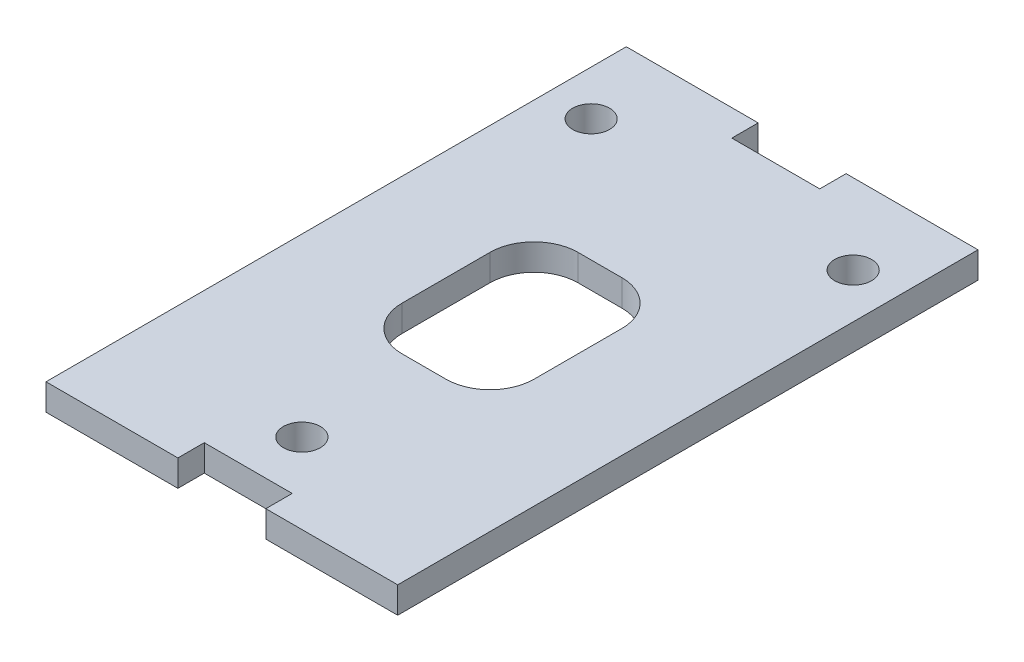
ISO-10303-21;
HEADER;
FILE_DESCRIPTION(('STEP AP214'),'2;1');
FILE_NAME('part.step','',(''),(''),'','','');
FILE_SCHEMA(('AUTOMOTIVE_DESIGN { 1 0 10303 214 1 1 1 1 }'));
ENDSEC;
DATA;
#1=APPLICATION_CONTEXT('core data for automotive mechanical design processes');
#2=APPLICATION_PROTOCOL_DEFINITION('international standard','automotive_design',2000,#1);
#3=PRODUCT_CONTEXT('',#1,'mechanical');
#4=PRODUCT('Part','Part','',(#3));
#5=PRODUCT_RELATED_PRODUCT_CATEGORY('part','',(#4));
#6=PRODUCT_DEFINITION_FORMATION('','',#4);
#7=PRODUCT_DEFINITION_CONTEXT('part definition',#1,'design');
#8=PRODUCT_DEFINITION('design','',#6,#7);
#9=PRODUCT_DEFINITION_SHAPE('','',#8);
#10=(LENGTH_UNIT() NAMED_UNIT(*) SI_UNIT(.MILLI.,.METRE.));
#11=(NAMED_UNIT(*) PLANE_ANGLE_UNIT() SI_UNIT($,.RADIAN.));
#12=(NAMED_UNIT(*) SI_UNIT($,.STERADIAN.) SOLID_ANGLE_UNIT());
#13=UNCERTAINTY_MEASURE_WITH_UNIT(LENGTH_MEASURE(1.E-05),#10,'distance_accuracy_value','');
#14=(GEOMETRIC_REPRESENTATION_CONTEXT(3) GLOBAL_UNCERTAINTY_ASSIGNED_CONTEXT((#13)) GLOBAL_UNIT_ASSIGNED_CONTEXT((#10,
#11,#12)) REPRESENTATION_CONTEXT('',''));
#15=CARTESIAN_POINT('',(0.,0.,0.));
#16=DIRECTION('',(0.,0.,1.));
#17=DIRECTION('',(1.,0.,0.));
#18=AXIS2_PLACEMENT_3D('',#15,#16,#17);
#19=CARTESIAN_POINT('',(0.,3.,-2.99999999999996));
#20=DIRECTION('',(0.,0.,-1.));
#21=DIRECTION('',(-1.,0.,0.));
#22=AXIS2_PLACEMENT_3D('',#19,#20,#21);
#23=PLANE('',#22);
#24=DIRECTION('',(1.,0.,0.));
#25=VECTOR('',#24,1.);
#26=CARTESIAN_POINT('',(0.,0.,-2.99999999999996));
#27=LINE('',#26,#25);
#28=CARTESIAN_POINT('',(15.,0.,-2.99999999999998));
#29=VERTEX_POINT('',#28);
#30=CARTESIAN_POINT('',(25.,0.,-2.99999999999999));
#31=VERTEX_POINT('',#30);
#32=EDGE_CURVE('E196',#29,#31,#27,.T.);
#33=ORIENTED_EDGE('',*,*,#32,.T.);
#34=DIRECTION('',(0.,-1.,0.));
#35=VECTOR('',#34,1.);
#36=CARTESIAN_POINT('',(25.,3.,-2.99999999999999));
#37=LINE('',#36,#35);
#38=CARTESIAN_POINT('',(25.,3.,-2.99999999999999));
#39=VERTEX_POINT('',#38);
#40=EDGE_CURVE('E194',#39,#31,#37,.T.);
#41=ORIENTED_EDGE('',*,*,#40,.F.);
#42=DIRECTION('',(1.,0.,0.));
#43=VECTOR('',#42,1.);
#44=CARTESIAN_POINT('',(0.,3.,-2.99999999999996));
#45=LINE('',#44,#43);
#46=CARTESIAN_POINT('',(15.,3.,-2.99999999999998));
#47=VERTEX_POINT('',#46);
#48=EDGE_CURVE('E180',#47,#39,#45,.T.);
#49=ORIENTED_EDGE('',*,*,#48,.F.);
#50=DIRECTION('',(0.,-1.,0.));
#51=VECTOR('',#50,1.);
#52=CARTESIAN_POINT('',(15.,3.,-2.99999999999998));
#53=LINE('',#52,#51);
#54=EDGE_CURVE('E244',#47,#29,#53,.T.);
#55=ORIENTED_EDGE('',*,*,#54,.T.);
#56=EDGE_LOOP('',(#33,#41,#49,#55));
#57=FACE_BOUND('',#56,.T.);
#58=ADVANCED_FACE('F42',(#57),#23,.F.);
#59=CARTESIAN_POINT('',(25.,3.,0.));
#60=DIRECTION('',(-1.,0.,0.));
#61=DIRECTION('',(0.,0.,1.));
#62=AXIS2_PLACEMENT_3D('',#59,#60,#61);
#63=PLANE('',#62);
#64=DIRECTION('',(0.,0.,-1.));
#65=VECTOR('',#64,1.);
#66=CARTESIAN_POINT('',(25.,0.,0.));
#67=LINE('',#66,#65);
#68=CARTESIAN_POINT('',(25.,0.,0.));
#69=VERTEX_POINT('',#68);
#70=EDGE_CURVE('E260',#69,#31,#67,.T.);
#71=ORIENTED_EDGE('',*,*,#70,.F.);
#72=DIRECTION('',(0.,-1.,0.));
#73=VECTOR('',#72,1.);
#74=CARTESIAN_POINT('',(25.,3.,0.));
#75=LINE('',#74,#73);
#76=CARTESIAN_POINT('',(25.,3.,0.));
#77=VERTEX_POINT('',#76);
#78=EDGE_CURVE('E202',#77,#69,#75,.T.);
#79=ORIENTED_EDGE('',*,*,#78,.F.);
#80=DIRECTION('',(0.,0.,-1.));
#81=VECTOR('',#80,1.);
#82=CARTESIAN_POINT('',(25.,3.,0.));
#83=LINE('',#82,#81);
#84=EDGE_CURVE('E184',#77,#39,#83,.T.);
#85=ORIENTED_EDGE('',*,*,#84,.T.);
#86=ORIENTED_EDGE('',*,*,#40,.T.);
#87=EDGE_LOOP('',(#71,#79,#85,#86));
#88=FACE_BOUND('',#87,.T.);
#89=ADVANCED_FACE('F204',(#88),#63,.T.);
#90=CARTESIAN_POINT('',(0.,3.,0.));
#91=DIRECTION('',(0.,0.,-1.));
#92=DIRECTION('',(-1.,0.,0.));
#93=AXIS2_PLACEMENT_3D('',#90,#91,#92);
#94=PLANE('',#93);
#95=DIRECTION('',(1.,0.,0.));
#96=VECTOR('',#95,1.);
#97=CARTESIAN_POINT('',(0.,0.,0.));
#98=LINE('',#97,#96);
#99=CARTESIAN_POINT('',(40.,0.,0.));
#100=VERTEX_POINT('',#99);
#101=EDGE_CURVE('E263',#69,#100,#98,.T.);
#102=ORIENTED_EDGE('',*,*,#101,.T.);
#103=DIRECTION('',(0.,-1.,0.));
#104=VECTOR('',#103,1.);
#105=CARTESIAN_POINT('',(40.,3.,0.));
#106=LINE('',#105,#104);
#107=CARTESIAN_POINT('',(40.,3.,0.));
#108=VERTEX_POINT('',#107);
#109=EDGE_CURVE('E328',#108,#100,#106,.T.);
#110=ORIENTED_EDGE('',*,*,#109,.F.);
#111=DIRECTION('',(1.,0.,0.));
#112=VECTOR('',#111,1.);
#113=CARTESIAN_POINT('',(0.,3.,0.));
#114=LINE('',#113,#112);
#115=EDGE_CURVE('E207',#77,#108,#114,.T.);
#116=ORIENTED_EDGE('',*,*,#115,.F.);
#117=ORIENTED_EDGE('',*,*,#78,.T.);
#118=EDGE_LOOP('',(#102,#110,#116,#117));
#119=FACE_BOUND('',#118,.T.);
#120=ADVANCED_FACE('F452',(#119),#94,.F.);
#121=CARTESIAN_POINT('',(40.,3.,0.));
#122=DIRECTION('',(-1.,0.,0.));
#123=DIRECTION('',(0.,0.,1.));
#124=AXIS2_PLACEMENT_3D('',#121,#122,#123);
#125=PLANE('',#124);
#126=DIRECTION('',(0.,0.,-1.));
#127=VECTOR('',#126,1.);
#128=CARTESIAN_POINT('',(40.,0.,0.));
#129=LINE('',#128,#127);
#130=CARTESIAN_POINT('',(40.,0.,-66.));
#131=VERTEX_POINT('',#130);
#132=EDGE_CURVE('E266',#100,#131,#129,.T.);
#133=ORIENTED_EDGE('',*,*,#132,.T.);
#134=DIRECTION('',(0.,-1.,0.));
#135=VECTOR('',#134,1.);
#136=CARTESIAN_POINT('',(40.,3.,-66.));
#137=LINE('',#136,#135);
#138=CARTESIAN_POINT('',(40.,3.,-66.));
#139=VERTEX_POINT('',#138);
#140=EDGE_CURVE('E325',#139,#131,#137,.T.);
#141=ORIENTED_EDGE('',*,*,#140,.F.);
#142=DIRECTION('',(0.,0.,-1.));
#143=VECTOR('',#142,1.);
#144=CARTESIAN_POINT('',(40.,3.,0.));
#145=LINE('',#144,#143);
#146=EDGE_CURVE('E210',#108,#139,#145,.T.);
#147=ORIENTED_EDGE('',*,*,#146,.F.);
#148=ORIENTED_EDGE('',*,*,#109,.T.);
#149=EDGE_LOOP('',(#133,#141,#147,#148));
#150=FACE_BOUND('',#149,.T.);
#151=ADVANCED_FACE('F669',(#150),#125,.F.);
#152=CARTESIAN_POINT('',(0.,3.,-66.));
#153=DIRECTION('',(0.,0.,-1.));
#154=DIRECTION('',(-1.,0.,0.));
#155=AXIS2_PLACEMENT_3D('',#152,#153,#154);
#156=PLANE('',#155);
#157=DIRECTION('',(1.,0.,0.));
#158=VECTOR('',#157,1.);
#159=CARTESIAN_POINT('',(0.,0.,-66.));
#160=LINE('',#159,#158);
#161=CARTESIAN_POINT('',(25.,0.,-66.));
#162=VERTEX_POINT('',#161);
#163=EDGE_CURVE('E270',#162,#131,#160,.T.);
#164=ORIENTED_EDGE('',*,*,#163,.F.);
#165=DIRECTION('',(0.,-1.,0.));
#166=VECTOR('',#165,1.);
#167=CARTESIAN_POINT('',(25.,3.,-66.));
#168=LINE('',#167,#166);
#169=CARTESIAN_POINT('',(25.,3.,-66.));
#170=VERTEX_POINT('',#169);
#171=EDGE_CURVE('E322',#170,#162,#168,.T.);
#172=ORIENTED_EDGE('',*,*,#171,.F.);
#173=DIRECTION('',(1.,0.,0.));
#174=VECTOR('',#173,1.);
#175=CARTESIAN_POINT('',(0.,3.,-66.));
#176=LINE('',#175,#174);
#177=EDGE_CURVE('E216',#170,#139,#176,.T.);
#178=ORIENTED_EDGE('',*,*,#177,.T.);
#179=ORIENTED_EDGE('',*,*,#140,.T.);
#180=EDGE_LOOP('',(#164,#172,#178,#179));
#181=FACE_BOUND('',#180,.T.);
#182=ADVANCED_FACE('F659',(#181),#156,.T.);
#183=CARTESIAN_POINT('',(25.,3.,0.));
#184=DIRECTION('',(1.,0.,0.));
#185=DIRECTION('',(0.,0.,-1.));
#186=AXIS2_PLACEMENT_3D('',#183,#184,#185);
#187=PLANE('',#186);
#188=DIRECTION('',(0.,0.,1.));
#189=VECTOR('',#188,1.);
#190=CARTESIAN_POINT('',(25.,0.,0.));
#191=LINE('',#190,#189);
#192=CARTESIAN_POINT('',(25.,0.,-63.));
#193=VERTEX_POINT('',#192);
#194=EDGE_CURVE('E274',#162,#193,#191,.T.);
#195=ORIENTED_EDGE('',*,*,#194,.T.);
#196=DIRECTION('',(0.,-1.,0.));
#197=VECTOR('',#196,1.);
#198=CARTESIAN_POINT('',(25.,3.,-63.));
#199=LINE('',#198,#197);
#200=CARTESIAN_POINT('',(25.,3.,-63.));
#201=VERTEX_POINT('',#200);
#202=EDGE_CURVE('E319',#201,#193,#199,.T.);
#203=ORIENTED_EDGE('',*,*,#202,.F.);
#204=DIRECTION('',(0.,0.,1.));
#205=VECTOR('',#204,1.);
#206=CARTESIAN_POINT('',(25.,3.,0.));
#207=LINE('',#206,#205);
#208=EDGE_CURVE('E220',#170,#201,#207,.T.);
#209=ORIENTED_EDGE('',*,*,#208,.F.);
#210=ORIENTED_EDGE('',*,*,#171,.T.);
#211=EDGE_LOOP('',(#195,#203,#209,#210));
#212=FACE_BOUND('',#211,.T.);
#213=ADVANCED_FACE('F649',(#212),#187,.F.);
#214=CARTESIAN_POINT('',(0.,3.,-63.));
#215=DIRECTION('',(0.,0.,-1.));
#216=DIRECTION('',(-1.,0.,0.));
#217=AXIS2_PLACEMENT_3D('',#214,#215,#216);
#218=PLANE('',#217);
#219=DIRECTION('',(1.,0.,0.));
#220=VECTOR('',#219,1.);
#221=CARTESIAN_POINT('',(0.,0.,-63.));
#222=LINE('',#221,#220);
#223=CARTESIAN_POINT('',(15.,0.,-63.));
#224=VERTEX_POINT('',#223);
#225=EDGE_CURVE('E278',#224,#193,#222,.T.);
#226=ORIENTED_EDGE('',*,*,#225,.F.);
#227=DIRECTION('',(0.,-1.,0.));
#228=VECTOR('',#227,1.);
#229=CARTESIAN_POINT('',(15.,3.,-63.));
#230=LINE('',#229,#228);
#231=CARTESIAN_POINT('',(15.,3.,-63.));
#232=VERTEX_POINT('',#231);
#233=EDGE_CURVE('E316',#232,#224,#230,.T.);
#234=ORIENTED_EDGE('',*,*,#233,.F.);
#235=DIRECTION('',(1.,0.,0.));
#236=VECTOR('',#235,1.);
#237=CARTESIAN_POINT('',(0.,3.,-63.));
#238=LINE('',#237,#236);
#239=EDGE_CURVE('E223',#232,#201,#238,.T.);
#240=ORIENTED_EDGE('',*,*,#239,.T.);
#241=ORIENTED_EDGE('',*,*,#202,.T.);
#242=EDGE_LOOP('',(#226,#234,#240,#241));
#243=FACE_BOUND('',#242,.T.);
#244=ADVANCED_FACE('F638',(#243),#218,.T.);
#245=CARTESIAN_POINT('',(15.,3.,0.));
#246=DIRECTION('',(1.,0.,0.));
#247=DIRECTION('',(0.,0.,-1.));
#248=AXIS2_PLACEMENT_3D('',#245,#246,#247);
#249=PLANE('',#248);
#250=DIRECTION('',(0.,0.,1.));
#251=VECTOR('',#250,1.);
#252=CARTESIAN_POINT('',(15.,0.,0.));
#253=LINE('',#252,#251);
#254=CARTESIAN_POINT('',(15.,0.,-66.));
#255=VERTEX_POINT('',#254);
#256=EDGE_CURVE('E282',#255,#224,#253,.T.);
#257=ORIENTED_EDGE('',*,*,#256,.F.);
#258=DIRECTION('',(0.,-1.,0.));
#259=VECTOR('',#258,1.);
#260=CARTESIAN_POINT('',(15.,3.,-66.));
#261=LINE('',#260,#259);
#262=CARTESIAN_POINT('',(15.,3.,-66.));
#263=VERTEX_POINT('',#262);
#264=EDGE_CURVE('E313',#263,#255,#261,.T.);
#265=ORIENTED_EDGE('',*,*,#264,.F.);
#266=DIRECTION('',(0.,0.,1.));
#267=VECTOR('',#266,1.);
#268=CARTESIAN_POINT('',(15.,3.,0.));
#269=LINE('',#268,#267);
#270=EDGE_CURVE('E227',#263,#232,#269,.T.);
#271=ORIENTED_EDGE('',*,*,#270,.T.);
#272=ORIENTED_EDGE('',*,*,#233,.T.);
#273=EDGE_LOOP('',(#257,#265,#271,#272));
#274=FACE_BOUND('',#273,.T.);
#275=ADVANCED_FACE('F628',(#274),#249,.T.);
#276=CARTESIAN_POINT('',(0.,3.,-66.));
#277=DIRECTION('',(0.,0.,-1.));
#278=DIRECTION('',(-1.,0.,0.));
#279=AXIS2_PLACEMENT_3D('',#276,#277,#278);
#280=PLANE('',#279);
#281=DIRECTION('',(1.,0.,0.));
#282=VECTOR('',#281,1.);
#283=CARTESIAN_POINT('',(0.,0.,-66.));
#284=LINE('',#283,#282);
#285=CARTESIAN_POINT('',(0.,0.,-66.));
#286=VERTEX_POINT('',#285);
#287=EDGE_CURVE('E286',#286,#255,#284,.T.);
#288=ORIENTED_EDGE('',*,*,#287,.F.);
#289=DIRECTION('',(0.,-1.,0.));
#290=VECTOR('',#289,1.);
#291=CARTESIAN_POINT('',(0.,3.,-66.));
#292=LINE('',#291,#290);
#293=CARTESIAN_POINT('',(0.,3.,-66.));
#294=VERTEX_POINT('',#293);
#295=EDGE_CURVE('E310',#294,#286,#292,.T.);
#296=ORIENTED_EDGE('',*,*,#295,.F.);
#297=DIRECTION('',(1.,0.,0.));
#298=VECTOR('',#297,1.);
#299=CARTESIAN_POINT('',(0.,3.,-66.));
#300=LINE('',#299,#298);
#301=EDGE_CURVE('E231',#294,#263,#300,.T.);
#302=ORIENTED_EDGE('',*,*,#301,.T.);
#303=ORIENTED_EDGE('',*,*,#264,.T.);
#304=EDGE_LOOP('',(#288,#296,#302,#303));
#305=FACE_BOUND('',#304,.T.);
#306=ADVANCED_FACE('F618',(#305),#280,.T.);
#307=CARTESIAN_POINT('',(0.,3.,0.));
#308=DIRECTION('',(-1.,0.,0.));
#309=DIRECTION('',(0.,0.,1.));
#310=AXIS2_PLACEMENT_3D('',#307,#308,#309);
#311=PLANE('',#310);
#312=DIRECTION('',(0.,0.,-1.));
#313=VECTOR('',#312,1.);
#314=CARTESIAN_POINT('',(0.,0.,0.));
#315=LINE('',#314,#313);
#316=CARTESIAN_POINT('',(0.,0.,0.));
#317=VERTEX_POINT('',#316);
#318=EDGE_CURVE('E290',#317,#286,#315,.T.);
#319=ORIENTED_EDGE('',*,*,#318,.F.);
#320=DIRECTION('',(0.,-1.,0.));
#321=VECTOR('',#320,1.);
#322=CARTESIAN_POINT('',(0.,3.,0.));
#323=LINE('',#322,#321);
#324=CARTESIAN_POINT('',(0.,3.,0.));
#325=VERTEX_POINT('',#324);
#326=EDGE_CURVE('E307',#325,#317,#323,.T.);
#327=ORIENTED_EDGE('',*,*,#326,.F.);
#328=DIRECTION('',(0.,0.,-1.));
#329=VECTOR('',#328,1.);
#330=CARTESIAN_POINT('',(0.,3.,0.));
#331=LINE('',#330,#329);
#332=EDGE_CURVE('E235',#325,#294,#331,.T.);
#333=ORIENTED_EDGE('',*,*,#332,.T.);
#334=ORIENTED_EDGE('',*,*,#295,.T.);
#335=EDGE_LOOP('',(#319,#327,#333,#334));
#336=FACE_BOUND('',#335,.T.);
#337=ADVANCED_FACE('F607',(#336),#311,.T.);
#338=CARTESIAN_POINT('',(0.,3.,0.));
#339=DIRECTION('',(0.,0.,-1.));
#340=DIRECTION('',(-1.,0.,0.));
#341=AXIS2_PLACEMENT_3D('',#338,#339,#340);
#342=PLANE('',#341);
#343=DIRECTION('',(1.,0.,0.));
#344=VECTOR('',#343,1.);
#345=CARTESIAN_POINT('',(0.,0.,0.));
#346=LINE('',#345,#344);
#347=CARTESIAN_POINT('',(15.,0.,0.));
#348=VERTEX_POINT('',#347);
#349=EDGE_CURVE('E294',#317,#348,#346,.T.);
#350=ORIENTED_EDGE('',*,*,#349,.T.);
#351=DIRECTION('',(0.,-1.,0.));
#352=VECTOR('',#351,1.);
#353=CARTESIAN_POINT('',(15.,3.,0.));
#354=LINE('',#353,#352);
#355=CARTESIAN_POINT('',(15.,3.,0.));
#356=VERTEX_POINT('',#355);
#357=EDGE_CURVE('E303',#356,#348,#354,.T.);
#358=ORIENTED_EDGE('',*,*,#357,.F.);
#359=DIRECTION('',(1.,0.,0.));
#360=VECTOR('',#359,1.);
#361=CARTESIAN_POINT('',(0.,3.,0.));
#362=LINE('',#361,#360);
#363=EDGE_CURVE('E239',#325,#356,#362,.T.);
#364=ORIENTED_EDGE('',*,*,#363,.F.);
#365=ORIENTED_EDGE('',*,*,#326,.T.);
#366=EDGE_LOOP('',(#350,#358,#364,#365));
#367=FACE_BOUND('',#366,.T.);
#368=ADVANCED_FACE('F459',(#367),#342,.F.);
#369=CARTESIAN_POINT('',(5.1,3.,-56.9));
#370=DIRECTION('',(0.,-1.,0.));
#371=DIRECTION('',(0.,0.,-1.));
#372=AXIS2_PLACEMENT_3D('',#369,#370,#371);
#373=CYLINDRICAL_SURFACE('',#372,2.1);
#374=CARTESIAN_POINT('',(5.1,3.,-56.9));
#375=DIRECTION('',(0.,1.,0.));
#376=DIRECTION('',(0.,0.,1.));
#377=AXIS2_PLACEMENT_3D('',#374,#375,#376);
#378=CIRCLE('',#377,2.1);
#379=CARTESIAN_POINT('',(5.1,3.,-54.8));
#380=VERTEX_POINT('',#379);
#381=EDGE_CURVE('E191',#380,#380,#378,.T.);
#382=ORIENTED_EDGE('',*,*,#381,.T.);
#383=EDGE_LOOP('',(#382));
#384=FACE_BOUND('',#383,.T.);
#385=CARTESIAN_POINT('',(5.1,0.,-56.9));
#386=DIRECTION('',(0.,1.,0.));
#387=DIRECTION('',(0.,0.,1.));
#388=AXIS2_PLACEMENT_3D('',#385,#386,#387);
#389=CIRCLE('',#388,2.1);
#390=CARTESIAN_POINT('',(5.1,0.,-54.8));
#391=VERTEX_POINT('',#390);
#392=EDGE_CURVE('E254',#391,#391,#389,.T.);
#393=ORIENTED_EDGE('',*,*,#392,.F.);
#394=EDGE_LOOP('',(#393));
#395=FACE_BOUND('',#394,.T.);
#396=ADVANCED_FACE('F430',(#384,#395),#373,.F.);
#397=CARTESIAN_POINT('',(34.9,3.,-56.9));
#398=DIRECTION('',(0.,-1.,0.));
#399=DIRECTION('',(0.,0.,-1.));
#400=AXIS2_PLACEMENT_3D('',#397,#398,#399);
#401=CYLINDRICAL_SURFACE('',#400,2.1);
#402=CARTESIAN_POINT('',(34.9,3.,-56.9));
#403=DIRECTION('',(0.,1.,0.));
#404=DIRECTION('',(0.,0.,1.));
#405=AXIS2_PLACEMENT_3D('',#402,#403,#404);
#406=CIRCLE('',#405,2.1);
#407=CARTESIAN_POINT('',(34.9,3.,-54.8));
#408=VERTEX_POINT('',#407);
#409=EDGE_CURVE('E423',#408,#408,#406,.T.);
#410=ORIENTED_EDGE('',*,*,#409,.T.);
#411=EDGE_LOOP('',(#410));
#412=FACE_BOUND('',#411,.T.);
#413=CARTESIAN_POINT('',(34.9,0.,-56.9));
#414=DIRECTION('',(0.,1.,0.));
#415=DIRECTION('',(0.,0.,1.));
#416=AXIS2_PLACEMENT_3D('',#413,#414,#415);
#417=CIRCLE('',#416,2.1);
#418=CARTESIAN_POINT('',(34.9,0.,-54.8));
#419=VERTEX_POINT('',#418);
#420=EDGE_CURVE('E249',#419,#419,#417,.T.);
#421=ORIENTED_EDGE('',*,*,#420,.F.);
#422=EDGE_LOOP('',(#421));
#423=FACE_BOUND('',#422,.T.);
#424=ADVANCED_FACE('F458',(#412,#423),#401,.F.);
#425=CARTESIAN_POINT('',(20.,3.,-9.10000000000001));
#426=DIRECTION('',(0.,-1.,0.));
#427=DIRECTION('',(0.,0.,-1.));
#428=AXIS2_PLACEMENT_3D('',#425,#426,#427);
#429=CYLINDRICAL_SURFACE('',#428,2.1);
#430=CARTESIAN_POINT('',(20.,3.,-9.10000000000001));
#431=DIRECTION('',(0.,1.,0.));
#432=DIRECTION('',(0.,0.,1.));
#433=AXIS2_PLACEMENT_3D('',#430,#431,#432);
#434=CIRCLE('',#433,2.1);
#435=CARTESIAN_POINT('',(20.,3.,-7.00000000000001));
#436=VERTEX_POINT('',#435);
#437=EDGE_CURVE('E300',#436,#436,#434,.T.);
#438=ORIENTED_EDGE('',*,*,#437,.T.);
#439=EDGE_LOOP('',(#438));
#440=FACE_BOUND('',#439,.T.);
#441=CARTESIAN_POINT('',(20.,0.,-9.10000000000001));
#442=DIRECTION('',(0.,1.,0.));
#443=DIRECTION('',(0.,0.,1.));
#444=AXIS2_PLACEMENT_3D('',#441,#442,#443);
#445=CIRCLE('',#444,2.1);
#446=CARTESIAN_POINT('',(20.,0.,-7.00000000000001));
#447=VERTEX_POINT('',#446);
#448=EDGE_CURVE('E245',#447,#447,#445,.T.);
#449=ORIENTED_EDGE('',*,*,#448,.F.);
#450=EDGE_LOOP('',(#449));
#451=FACE_BOUND('',#450,.T.);
#452=ADVANCED_FACE('F443',(#440,#451),#429,.F.);
#453=CARTESIAN_POINT('',(15.,3.,0.));
#454=DIRECTION('',(-1.,0.,0.));
#455=DIRECTION('',(0.,0.,1.));
#456=AXIS2_PLACEMENT_3D('',#453,#454,#455);
#457=PLANE('',#456);
#458=DIRECTION('',(0.,0.,-1.));
#459=VECTOR('',#458,1.);
#460=CARTESIAN_POINT('',(15.,0.,0.));
#461=LINE('',#460,#459);
#462=EDGE_CURVE('E297',#348,#29,#461,.T.);
#463=ORIENTED_EDGE('',*,*,#462,.T.);
#464=ORIENTED_EDGE('',*,*,#54,.F.);
#465=DIRECTION('',(0.,0.,-1.));
#466=VECTOR('',#465,1.);
#467=CARTESIAN_POINT('',(15.,3.,0.));
#468=LINE('',#467,#466);
#469=EDGE_CURVE('E186',#356,#47,#468,.T.);
#470=ORIENTED_EDGE('',*,*,#469,.F.);
#471=ORIENTED_EDGE('',*,*,#357,.T.);
#472=EDGE_LOOP('',(#463,#464,#470,#471));
#473=FACE_BOUND('',#472,.T.);
#474=ADVANCED_FACE('F435',(#473),#457,.F.);
#475=CARTESIAN_POINT('',(0.,3.,0.));
#476=DIRECTION('',(0.,1.,0.));
#477=DIRECTION('',(0.,0.,1.));
#478=AXIS2_PLACEMENT_3D('',#475,#476,#477);
#479=PLANE('',#478);
#480=DIRECTION('',(0.,0.,1.));
#481=VECTOR('',#480,1.);
#482=CARTESIAN_POINT('',(12.5,3.,-43.));
#483=LINE('',#482,#481);
#484=CARTESIAN_POINT('',(12.5,3.,-38.));
#485=VERTEX_POINT('',#484);
#486=CARTESIAN_POINT('',(12.5,3.,-28.));
#487=VERTEX_POINT('',#486);
#488=EDGE_CURVE('E384',#485,#487,#483,.T.);
#489=ORIENTED_EDGE('',*,*,#488,.F.);
#490=CARTESIAN_POINT('',(17.5,3.,-38.));
#491=DIRECTION('',(0.,1.,0.));
#492=DIRECTION('',(0.,0.,1.));
#493=AXIS2_PLACEMENT_3D('',#490,#491,#492);
#494=CIRCLE('',#493,5.);
#495=CARTESIAN_POINT('',(17.5,3.,-43.));
#496=VERTEX_POINT('',#495);
#497=EDGE_CURVE('E51',#485,#496,#494,.F.);
#498=ORIENTED_EDGE('',*,*,#497,.T.);
#499=DIRECTION('',(-1.,0.,0.));
#500=VECTOR('',#499,1.);
#501=CARTESIAN_POINT('',(12.5,3.,-43.));
#502=LINE('',#501,#500);
#503=CARTESIAN_POINT('',(22.5,3.,-43.));
#504=VERTEX_POINT('',#503);
#505=EDGE_CURVE('E383',#504,#496,#502,.T.);
#506=ORIENTED_EDGE('',*,*,#505,.F.);
#507=CARTESIAN_POINT('',(22.5,3.,-38.));
#508=DIRECTION('',(0.,1.,0.));
#509=DIRECTION('',(0.,0.,1.));
#510=AXIS2_PLACEMENT_3D('',#507,#508,#509);
#511=CIRCLE('',#510,5.);
#512=CARTESIAN_POINT('',(27.5,3.,-38.));
#513=VERTEX_POINT('',#512);
#514=EDGE_CURVE('E360',#504,#513,#511,.F.);
#515=ORIENTED_EDGE('',*,*,#514,.T.);
#516=DIRECTION('',(0.,0.,-1.));
#517=VECTOR('',#516,1.);
#518=CARTESIAN_POINT('',(27.5,3.,-43.));
#519=LINE('',#518,#517);
#520=CARTESIAN_POINT('',(27.5,3.,-28.));
#521=VERTEX_POINT('',#520);
#522=EDGE_CURVE('E394',#521,#513,#519,.T.);
#523=ORIENTED_EDGE('',*,*,#522,.F.);
#524=CARTESIAN_POINT('',(22.5,3.,-28.));
#525=DIRECTION('',(0.,1.,0.));
#526=DIRECTION('',(0.,0.,1.));
#527=AXIS2_PLACEMENT_3D('',#524,#525,#526);
#528=CIRCLE('',#527,5.);
#529=CARTESIAN_POINT('',(22.5,3.,-23.));
#530=VERTEX_POINT('',#529);
#531=EDGE_CURVE('E366',#521,#530,#528,.F.);
#532=ORIENTED_EDGE('',*,*,#531,.T.);
#533=DIRECTION('',(1.,0.,0.));
#534=VECTOR('',#533,1.);
#535=CARTESIAN_POINT('',(12.5,3.,-23.));
#536=LINE('',#535,#534);
#537=CARTESIAN_POINT('',(17.5,3.,-23.));
#538=VERTEX_POINT('',#537);
#539=EDGE_CURVE('E413',#538,#530,#536,.T.);
#540=ORIENTED_EDGE('',*,*,#539,.F.);
#541=CARTESIAN_POINT('',(17.5,3.,-28.));
#542=DIRECTION('',(0.,1.,0.));
#543=DIRECTION('',(0.,0.,1.));
#544=AXIS2_PLACEMENT_3D('',#541,#542,#543);
#545=CIRCLE('',#544,5.);
#546=EDGE_CURVE('E372',#538,#487,#545,.F.);
#547=ORIENTED_EDGE('',*,*,#546,.T.);
#548=EDGE_LOOP('',(#489,#498,#506,#515,#523,#532,#540,#547));
#549=FACE_BOUND('',#548,.T.);
#550=ORIENTED_EDGE('',*,*,#437,.F.);
#551=EDGE_LOOP('',(#550));
#552=FACE_BOUND('',#551,.T.);
#553=ORIENTED_EDGE('',*,*,#409,.F.);
#554=EDGE_LOOP('',(#553));
#555=FACE_BOUND('',#554,.T.);
#556=ORIENTED_EDGE('',*,*,#381,.F.);
#557=EDGE_LOOP('',(#556));
#558=FACE_BOUND('',#557,.T.);
#559=ORIENTED_EDGE('',*,*,#48,.T.);
#560=ORIENTED_EDGE('',*,*,#84,.F.);
#561=ORIENTED_EDGE('',*,*,#115,.T.);
#562=ORIENTED_EDGE('',*,*,#146,.T.);
#563=ORIENTED_EDGE('',*,*,#177,.F.);
#564=ORIENTED_EDGE('',*,*,#208,.T.);
#565=ORIENTED_EDGE('',*,*,#239,.F.);
#566=ORIENTED_EDGE('',*,*,#270,.F.);
#567=ORIENTED_EDGE('',*,*,#301,.F.);
#568=ORIENTED_EDGE('',*,*,#332,.F.);
#569=ORIENTED_EDGE('',*,*,#363,.T.);
#570=ORIENTED_EDGE('',*,*,#469,.T.);
#571=EDGE_LOOP('',(#559,#560,#561,#562,#563,#564,#565,#566,#567,#568,#569,#570));
#572=FACE_BOUND('',#571,.T.);
#573=ADVANCED_FACE('F182',(#549,#552,#555,#558,#572),#479,.T.);
#574=CARTESIAN_POINT('',(0.,0.,0.));
#575=DIRECTION('',(0.,1.,0.));
#576=DIRECTION('',(0.,0.,1.));
#577=AXIS2_PLACEMENT_3D('',#574,#575,#576);
#578=PLANE('',#577);
#579=DIRECTION('',(0.,0.,-1.));
#580=VECTOR('',#579,1.);
#581=CARTESIAN_POINT('',(27.5,0.,-43.));
#582=LINE('',#581,#580);
#583=CARTESIAN_POINT('',(27.5,0.,-28.));
#584=VERTEX_POINT('',#583);
#585=CARTESIAN_POINT('',(27.5,0.,-38.));
#586=VERTEX_POINT('',#585);
#587=EDGE_CURVE('E403',#584,#586,#582,.T.);
#588=ORIENTED_EDGE('',*,*,#587,.T.);
#589=CARTESIAN_POINT('',(22.5,0.,-38.));
#590=DIRECTION('',(0.,1.,0.));
#591=DIRECTION('',(0.,0.,1.));
#592=AXIS2_PLACEMENT_3D('',#589,#590,#591);
#593=CIRCLE('',#592,5.);
#594=CARTESIAN_POINT('',(22.5,0.,-43.));
#595=VERTEX_POINT('',#594);
#596=EDGE_CURVE('E363',#586,#595,#593,.T.);
#597=ORIENTED_EDGE('',*,*,#596,.T.);
#598=DIRECTION('',(-1.,0.,0.));
#599=VECTOR('',#598,1.);
#600=CARTESIAN_POINT('',(12.5,0.,-43.));
#601=LINE('',#600,#599);
#602=CARTESIAN_POINT('',(17.5,0.,-43.));
#603=VERTEX_POINT('',#602);
#604=EDGE_CURVE('E250',#595,#603,#601,.T.);
#605=ORIENTED_EDGE('',*,*,#604,.T.);
#606=CARTESIAN_POINT('',(17.5,0.,-38.));
#607=DIRECTION('',(0.,1.,0.));
#608=DIRECTION('',(0.,0.,1.));
#609=AXIS2_PLACEMENT_3D('',#606,#607,#608);
#610=CIRCLE('',#609,5.);
#611=CARTESIAN_POINT('',(12.5,0.,-38.));
#612=VERTEX_POINT('',#611);
#613=EDGE_CURVE('E11',#603,#612,#610,.T.);
#614=ORIENTED_EDGE('',*,*,#613,.T.);
#615=DIRECTION('',(0.,0.,1.));
#616=VECTOR('',#615,1.);
#617=CARTESIAN_POINT('',(12.5,0.,-43.));
#618=LINE('',#617,#616);
#619=CARTESIAN_POINT('',(12.5,0.,-28.));
#620=VERTEX_POINT('',#619);
#621=EDGE_CURVE('E393',#612,#620,#618,.T.);
#622=ORIENTED_EDGE('',*,*,#621,.T.);
#623=CARTESIAN_POINT('',(17.5,0.,-28.));
#624=DIRECTION('',(0.,1.,0.));
#625=DIRECTION('',(0.,0.,1.));
#626=AXIS2_PLACEMENT_3D('',#623,#624,#625);
#627=CIRCLE('',#626,5.);
#628=CARTESIAN_POINT('',(17.5,0.,-23.));
#629=VERTEX_POINT('',#628);
#630=EDGE_CURVE('E375',#620,#629,#627,.T.);
#631=ORIENTED_EDGE('',*,*,#630,.T.);
#632=DIRECTION('',(1.,0.,0.));
#633=VECTOR('',#632,1.);
#634=CARTESIAN_POINT('',(12.5,0.,-23.));
#635=LINE('',#634,#633);
#636=CARTESIAN_POINT('',(22.5,0.,-23.));
#637=VERTEX_POINT('',#636);
#638=EDGE_CURVE('E399',#629,#637,#635,.T.);
#639=ORIENTED_EDGE('',*,*,#638,.T.);
#640=CARTESIAN_POINT('',(22.5,0.,-28.));
#641=DIRECTION('',(0.,1.,0.));
#642=DIRECTION('',(0.,0.,1.));
#643=AXIS2_PLACEMENT_3D('',#640,#641,#642);
#644=CIRCLE('',#643,5.);
#645=EDGE_CURVE('E369',#637,#584,#644,.T.);
#646=ORIENTED_EDGE('',*,*,#645,.T.);
#647=EDGE_LOOP('',(#588,#597,#605,#614,#622,#631,#639,#646));
#648=FACE_BOUND('',#647,.T.);
#649=ORIENTED_EDGE('',*,*,#448,.T.);
#650=EDGE_LOOP('',(#649));
#651=FACE_BOUND('',#650,.T.);
#652=ORIENTED_EDGE('',*,*,#420,.T.);
#653=EDGE_LOOP('',(#652));
#654=FACE_BOUND('',#653,.T.);
#655=ORIENTED_EDGE('',*,*,#392,.T.);
#656=EDGE_LOOP('',(#655));
#657=FACE_BOUND('',#656,.T.);
#658=ORIENTED_EDGE('',*,*,#32,.F.);
#659=ORIENTED_EDGE('',*,*,#462,.F.);
#660=ORIENTED_EDGE('',*,*,#349,.F.);
#661=ORIENTED_EDGE('',*,*,#318,.T.);
#662=ORIENTED_EDGE('',*,*,#287,.T.);
#663=ORIENTED_EDGE('',*,*,#256,.T.);
#664=ORIENTED_EDGE('',*,*,#225,.T.);
#665=ORIENTED_EDGE('',*,*,#194,.F.);
#666=ORIENTED_EDGE('',*,*,#163,.T.);
#667=ORIENTED_EDGE('',*,*,#132,.F.);
#668=ORIENTED_EDGE('',*,*,#101,.F.);
#669=ORIENTED_EDGE('',*,*,#70,.T.);
#670=EDGE_LOOP('',(#658,#659,#660,#661,#662,#663,#664,#665,#666,#667,#668,#669));
#671=FACE_BOUND('',#670,.T.);
#672=ADVANCED_FACE('F434',(#648,#651,#654,#657,#671),#578,.F.);
#673=CARTESIAN_POINT('',(12.5,0.,-43.));
#674=DIRECTION('',(-1.,0.,0.));
#675=DIRECTION('',(0.,0.,1.));
#676=AXIS2_PLACEMENT_3D('',#673,#674,#675);
#677=PLANE('',#676);
#678=ORIENTED_EDGE('',*,*,#488,.T.);
#679=DIRECTION('',(0.,1.,0.));
#680=VECTOR('',#679,1.);
#681=CARTESIAN_POINT('',(12.5,0.,-28.));
#682=LINE('',#681,#680);
#683=EDGE_CURVE('E58',#487,#620,#682,.F.);
#684=ORIENTED_EDGE('',*,*,#683,.T.);
#685=ORIENTED_EDGE('',*,*,#621,.F.);
#686=DIRECTION('',(0.,1.,0.));
#687=VECTOR('',#686,1.);
#688=CARTESIAN_POINT('',(12.5,3.,-38.));
#689=LINE('',#688,#687);
#690=EDGE_CURVE('E354',#612,#485,#689,.T.);
#691=ORIENTED_EDGE('',*,*,#690,.T.);
#692=EDGE_LOOP('',(#678,#684,#685,#691));
#693=FACE_BOUND('',#692,.T.);
#694=ADVANCED_FACE('F396',(#693),#677,.F.);
#695=CARTESIAN_POINT('',(12.5,0.,-43.));
#696=DIRECTION('',(0.,0.,-1.));
#697=DIRECTION('',(-1.,0.,0.));
#698=AXIS2_PLACEMENT_3D('',#695,#696,#697);
#699=PLANE('',#698);
#700=ORIENTED_EDGE('',*,*,#604,.F.);
#701=DIRECTION('',(0.,1.,0.));
#702=VECTOR('',#701,1.);
#703=CARTESIAN_POINT('',(22.5,3.,-43.));
#704=LINE('',#703,#702);
#705=EDGE_CURVE('E336',#595,#504,#704,.T.);
#706=ORIENTED_EDGE('',*,*,#705,.T.);
#707=ORIENTED_EDGE('',*,*,#505,.T.);
#708=DIRECTION('',(0.,1.,0.));
#709=VECTOR('',#708,1.);
#710=CARTESIAN_POINT('',(17.5,0.,-43.));
#711=LINE('',#710,#709);
#712=EDGE_CURVE('E201',#496,#603,#711,.F.);
#713=ORIENTED_EDGE('',*,*,#712,.T.);
#714=EDGE_LOOP('',(#700,#706,#707,#713));
#715=FACE_BOUND('',#714,.T.);
#716=ADVANCED_FACE('F390',(#715),#699,.F.);
#717=CARTESIAN_POINT('',(27.5,0.,-43.));
#718=DIRECTION('',(1.,0.,0.));
#719=DIRECTION('',(0.,0.,-1.));
#720=AXIS2_PLACEMENT_3D('',#717,#718,#719);
#721=PLANE('',#720);
#722=ORIENTED_EDGE('',*,*,#522,.T.);
#723=DIRECTION('',(0.,1.,0.));
#724=VECTOR('',#723,1.);
#725=CARTESIAN_POINT('',(27.5,0.,-38.));
#726=LINE('',#725,#724);
#727=EDGE_CURVE('E344',#513,#586,#726,.F.);
#728=ORIENTED_EDGE('',*,*,#727,.T.);
#729=ORIENTED_EDGE('',*,*,#587,.F.);
#730=DIRECTION('',(0.,1.,0.));
#731=VECTOR('',#730,1.);
#732=CARTESIAN_POINT('',(27.5,3.,-28.));
#733=LINE('',#732,#731);
#734=EDGE_CURVE('E340',#584,#521,#733,.T.);
#735=ORIENTED_EDGE('',*,*,#734,.T.);
#736=EDGE_LOOP('',(#722,#728,#729,#735));
#737=FACE_BOUND('',#736,.T.);
#738=ADVANCED_FACE('F491',(#737),#721,.F.);
#739=CARTESIAN_POINT('',(12.5,0.,-23.));
#740=DIRECTION('',(0.,0.,1.));
#741=DIRECTION('',(1.,0.,0.));
#742=AXIS2_PLACEMENT_3D('',#739,#740,#741);
#743=PLANE('',#742);
#744=ORIENTED_EDGE('',*,*,#539,.T.);
#745=DIRECTION('',(0.,1.,0.));
#746=VECTOR('',#745,1.);
#747=CARTESIAN_POINT('',(22.5,0.,-23.));
#748=LINE('',#747,#746);
#749=EDGE_CURVE('E351',#530,#637,#748,.F.);
#750=ORIENTED_EDGE('',*,*,#749,.T.);
#751=ORIENTED_EDGE('',*,*,#638,.F.);
#752=DIRECTION('',(0.,1.,0.));
#753=VECTOR('',#752,1.);
#754=CARTESIAN_POINT('',(17.5,3.,-23.));
#755=LINE('',#754,#753);
#756=EDGE_CURVE('E347',#629,#538,#755,.T.);
#757=ORIENTED_EDGE('',*,*,#756,.T.);
#758=EDGE_LOOP('',(#744,#750,#751,#757));
#759=FACE_BOUND('',#758,.T.);
#760=ADVANCED_FACE('F470',(#759),#743,.F.);
#761=CARTESIAN_POINT('',(22.5,0.,-38.));
#762=DIRECTION('',(0.,-1.,0.));
#763=DIRECTION('',(0.,0.,-1.));
#764=AXIS2_PLACEMENT_3D('',#761,#762,#763);
#765=CYLINDRICAL_SURFACE('',#764,5.);
#766=ORIENTED_EDGE('',*,*,#596,.F.);
#767=ORIENTED_EDGE('',*,*,#727,.F.);
#768=ORIENTED_EDGE('',*,*,#514,.F.);
#769=ORIENTED_EDGE('',*,*,#705,.F.);
#770=EDGE_LOOP('',(#766,#767,#768,#769));
#771=FACE_BOUND('',#770,.T.);
#772=ADVANCED_FACE('F466',(#771),#765,.F.);
#773=CARTESIAN_POINT('',(22.5,0.,-28.));
#774=DIRECTION('',(0.,-1.,0.));
#775=DIRECTION('',(0.,0.,-1.));
#776=AXIS2_PLACEMENT_3D('',#773,#774,#775);
#777=CYLINDRICAL_SURFACE('',#776,5.);
#778=ORIENTED_EDGE('',*,*,#645,.F.);
#779=ORIENTED_EDGE('',*,*,#749,.F.);
#780=ORIENTED_EDGE('',*,*,#531,.F.);
#781=ORIENTED_EDGE('',*,*,#734,.F.);
#782=EDGE_LOOP('',(#778,#779,#780,#781));
#783=FACE_BOUND('',#782,.T.);
#784=ADVANCED_FACE('F469',(#783),#777,.F.);
#785=CARTESIAN_POINT('',(17.5,0.,-28.));
#786=DIRECTION('',(0.,-1.,0.));
#787=DIRECTION('',(0.,0.,-1.));
#788=AXIS2_PLACEMENT_3D('',#785,#786,#787);
#789=CYLINDRICAL_SURFACE('',#788,5.);
#790=ORIENTED_EDGE('',*,*,#630,.F.);
#791=ORIENTED_EDGE('',*,*,#683,.F.);
#792=ORIENTED_EDGE('',*,*,#546,.F.);
#793=ORIENTED_EDGE('',*,*,#756,.F.);
#794=EDGE_LOOP('',(#790,#791,#792,#793));
#795=FACE_BOUND('',#794,.T.);
#796=ADVANCED_FACE('F473',(#795),#789,.F.);
#797=CARTESIAN_POINT('',(17.5,0.,-38.));
#798=DIRECTION('',(0.,-1.,0.));
#799=DIRECTION('',(0.,0.,-1.));
#800=AXIS2_PLACEMENT_3D('',#797,#798,#799);
#801=CYLINDRICAL_SURFACE('',#800,5.);
#802=ORIENTED_EDGE('',*,*,#613,.F.);
#803=ORIENTED_EDGE('',*,*,#712,.F.);
#804=ORIENTED_EDGE('',*,*,#497,.F.);
#805=ORIENTED_EDGE('',*,*,#690,.F.);
#806=EDGE_LOOP('',(#802,#803,#804,#805));
#807=FACE_BOUND('',#806,.T.);
#808=ADVANCED_FACE('F44',(#807),#801,.F.);
#809=CLOSED_SHELL('',(#58,#89,#120,#151,#182,#213,#244,#275,#306,#337,#368,#396,#424,#452,#474,
#573,#672,#694,#716,#738,#760,#772,#784,#796,#808));
#810=MANIFOLD_SOLID_BREP('B2',#809);
#811=ADVANCED_BREP_SHAPE_REPRESENTATION('',(#18,#810),#14);
#812=SHAPE_DEFINITION_REPRESENTATION(#9,#811);
ENDSEC;
END-ISO-10303-21;
